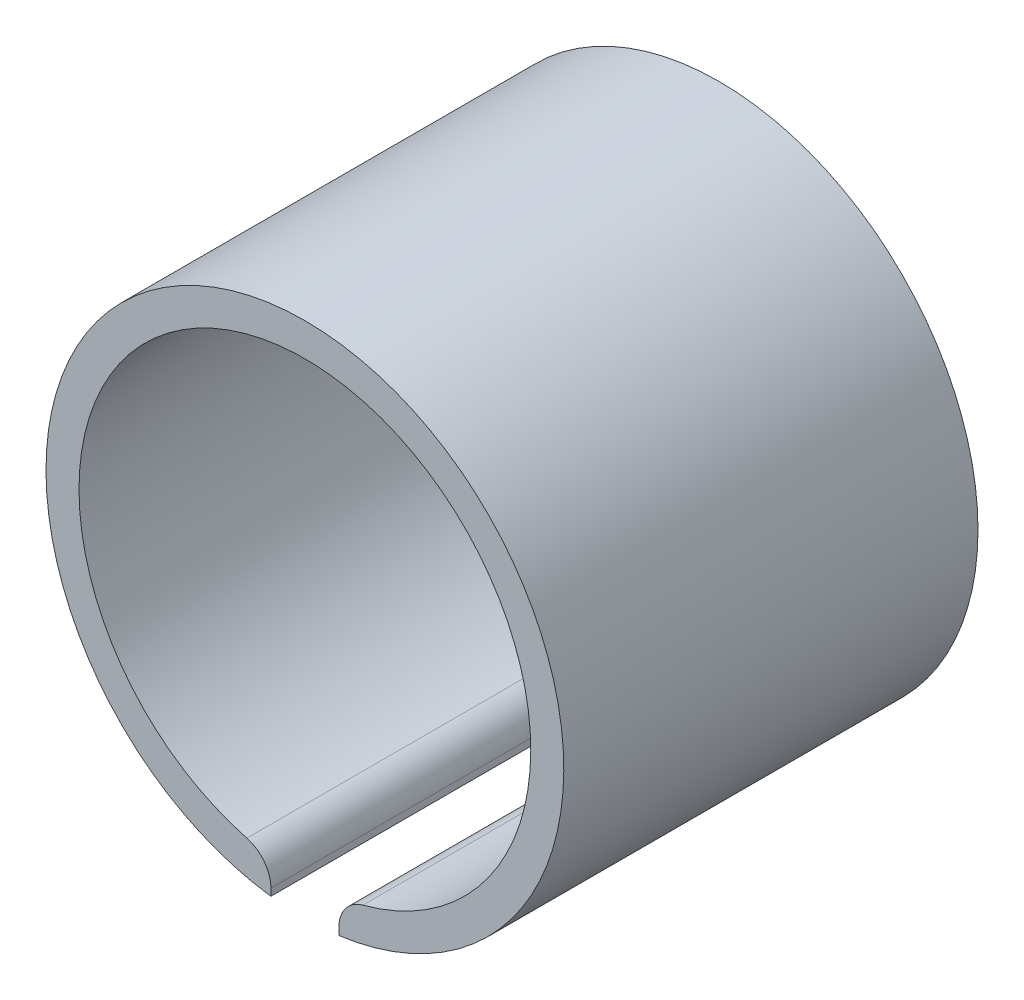
ISO-10303-21;
HEADER;
FILE_DESCRIPTION(('STEP AP214'),'2;1');
FILE_NAME('part.step','',(''),(''),'','','');
FILE_SCHEMA(('AUTOMOTIVE_DESIGN { 1 0 10303 214 1 1 1 1 }'));
ENDSEC;
DATA;
#1=APPLICATION_CONTEXT('core data for automotive mechanical design processes');
#2=APPLICATION_PROTOCOL_DEFINITION('international standard','automotive_design',2000,#1);
#3=PRODUCT_CONTEXT('',#1,'mechanical');
#4=PRODUCT('Part','Part','',(#3));
#5=PRODUCT_RELATED_PRODUCT_CATEGORY('part','',(#4));
#6=PRODUCT_DEFINITION_FORMATION('','',#4);
#7=PRODUCT_DEFINITION_CONTEXT('part definition',#1,'design');
#8=PRODUCT_DEFINITION('design','',#6,#7);
#9=PRODUCT_DEFINITION_SHAPE('','',#8);
#10=(LENGTH_UNIT() NAMED_UNIT(*) SI_UNIT(.MILLI.,.METRE.));
#11=(NAMED_UNIT(*) PLANE_ANGLE_UNIT() SI_UNIT($,.RADIAN.));
#12=(NAMED_UNIT(*) SI_UNIT($,.STERADIAN.) SOLID_ANGLE_UNIT());
#13=UNCERTAINTY_MEASURE_WITH_UNIT(LENGTH_MEASURE(1.E-05),#10,'distance_accuracy_value','');
#14=(GEOMETRIC_REPRESENTATION_CONTEXT(3) GLOBAL_UNCERTAINTY_ASSIGNED_CONTEXT((#13)) GLOBAL_UNIT_ASSIGNED_CONTEXT((#10,
#11,#12)) REPRESENTATION_CONTEXT('',''));
#15=CARTESIAN_POINT('',(0.,0.,0.));
#16=DIRECTION('',(0.,0.,1.));
#17=DIRECTION('',(1.,0.,0.));
#18=AXIS2_PLACEMENT_3D('',#15,#16,#17);
#19=CARTESIAN_POINT('',(0.,0.,2.));
#20=DIRECTION('',(0.,0.,1.));
#21=DIRECTION('',(1.,0.,0.));
#22=AXIS2_PLACEMENT_3D('',#19,#20,#21);
#23=PLANE('',#22);
#24=CARTESIAN_POINT('',(0.,0.,2.));
#25=DIRECTION('',(0.,0.,1.));
#26=DIRECTION('',(1.,0.,0.));
#27=AXIS2_PLACEMENT_3D('',#24,#25,#26);
#28=CIRCLE('',#27,5.);
#29=CARTESIAN_POINT('',(5.,0.,2.));
#30=VERTEX_POINT('',#29);
#31=EDGE_CURVE('E129',#30,#30,#28,.T.);
#32=ORIENTED_EDGE('',*,*,#31,.F.);
#33=EDGE_LOOP('',(#32));
#34=FACE_BOUND('',#33,.T.);
#35=DIRECTION('',(0.,-1.,0.));
#36=VECTOR('',#35,1.);
#37=CARTESIAN_POINT('',(2.625,0.,2.));
#38=LINE('',#37,#36);
#39=CARTESIAN_POINT('',(2.625,-19.2804791174908,2.));
#40=VERTEX_POINT('',#39);
#41=CARTESIAN_POINT('',(2.625,-19.8269860291472,2.));
#42=VERTEX_POINT('',#41);
#43=EDGE_CURVE('E108',#40,#42,#38,.T.);
#44=ORIENTED_EDGE('',*,*,#43,.F.);
#45=CARTESIAN_POINT('',(5.125,-19.2804791174908,2.));
#46=DIRECTION('',(0.,0.,1.));
#47=DIRECTION('',(1.,0.,0.));
#48=AXIS2_PLACEMENT_3D('',#45,#46,#47);
#49=CIRCLE('',#48,2.5);
#50=CARTESIAN_POINT('',(4.4827694235589,-16.8643789774544,2.));
#51=VERTEX_POINT('',#50);
#52=EDGE_CURVE('E47',#40,#51,#49,.F.);
#53=ORIENTED_EDGE('',*,*,#52,.T.);
#54=CARTESIAN_POINT('',(0.,0.,2.));
#55=DIRECTION('',(0.,0.,1.));
#56=DIRECTION('',(1.,0.,0.));
#57=AXIS2_PLACEMENT_3D('',#54,#55,#56);
#58=CIRCLE('',#57,17.45);
#59=CARTESIAN_POINT('',(-4.4827694235589,-16.8643789774544,2.));
#60=VERTEX_POINT('',#59);
#61=EDGE_CURVE('E123',#51,#60,#58,.T.);
#62=ORIENTED_EDGE('',*,*,#61,.T.);
#63=CARTESIAN_POINT('',(-5.125,-19.2804791174908,2.));
#64=DIRECTION('',(0.,0.,1.));
#65=DIRECTION('',(1.,0.,0.));
#66=AXIS2_PLACEMENT_3D('',#63,#64,#65);
#67=CIRCLE('',#66,2.5);
#68=CARTESIAN_POINT('',(-2.625,-19.2804791174908,2.));
#69=VERTEX_POINT('',#68);
#70=EDGE_CURVE('E11',#60,#69,#67,.F.);
#71=ORIENTED_EDGE('',*,*,#70,.T.);
#72=DIRECTION('',(0.,-1.,0.));
#73=VECTOR('',#72,1.);
#74=CARTESIAN_POINT('',(-2.625,0.,2.));
#75=LINE('',#74,#73);
#76=CARTESIAN_POINT('',(-2.625,-19.8269860291472,2.));
#77=VERTEX_POINT('',#76);
#78=EDGE_CURVE('E126',#69,#77,#75,.T.);
#79=ORIENTED_EDGE('',*,*,#78,.T.);
#80=CARTESIAN_POINT('',(0.,0.,2.));
#81=DIRECTION('',(0.,0.,1.));
#82=DIRECTION('',(1.,0.,0.));
#83=AXIS2_PLACEMENT_3D('',#80,#81,#82);
#84=CIRCLE('',#83,20.);
#85=EDGE_CURVE('E135',#77,#42,#84,.T.);
#86=ORIENTED_EDGE('',*,*,#85,.T.);
#87=EDGE_LOOP('',(#44,#53,#62,#71,#79,#86));
#88=FACE_BOUND('',#87,.T.);
#89=ADVANCED_FACE('F39',(#34,#88),#23,.T.);
#90=CARTESIAN_POINT('',(0.,0.,0.));
#91=DIRECTION('',(0.,0.,1.));
#92=DIRECTION('',(1.,0.,0.));
#93=AXIS2_PLACEMENT_3D('',#90,#91,#92);
#94=PLANE('',#93);
#95=CARTESIAN_POINT('',(0.,0.,0.));
#96=DIRECTION('',(0.,0.,1.));
#97=DIRECTION('',(1.,0.,0.));
#98=AXIS2_PLACEMENT_3D('',#95,#96,#97);
#99=CIRCLE('',#98,20.);
#100=CARTESIAN_POINT('',(20.,0.,0.));
#101=VERTEX_POINT('',#100);
#102=EDGE_CURVE('E132',#101,#101,#99,.T.);
#103=ORIENTED_EDGE('',*,*,#102,.F.);
#104=EDGE_LOOP('',(#103));
#105=FACE_BOUND('',#104,.T.);
#106=CARTESIAN_POINT('',(0.,0.,0.));
#107=DIRECTION('',(0.,0.,1.));
#108=DIRECTION('',(1.,0.,0.));
#109=AXIS2_PLACEMENT_3D('',#106,#107,#108);
#110=CIRCLE('',#109,5.);
#111=CARTESIAN_POINT('',(5.,0.,0.));
#112=VERTEX_POINT('',#111);
#113=EDGE_CURVE('E112',#112,#112,#110,.T.);
#114=ORIENTED_EDGE('',*,*,#113,.T.);
#115=EDGE_LOOP('',(#114));
#116=FACE_BOUND('',#115,.T.);
#117=ADVANCED_FACE('F167',(#105,#116),#94,.F.);
#118=CARTESIAN_POINT('',(0.,0.,2.));
#119=DIRECTION('',(0.,0.,-1.));
#120=DIRECTION('',(-1.,0.,0.));
#121=AXIS2_PLACEMENT_3D('',#118,#119,#120);
#122=CYLINDRICAL_SURFACE('',#121,20.);
#123=ORIENTED_EDGE('',*,*,#85,.F.);
#124=DIRECTION('',(0.,0.,-1.));
#125=VECTOR('',#124,1.);
#126=CARTESIAN_POINT('',(-2.625,-19.8269860291472,32.));
#127=LINE('',#126,#125);
#128=CARTESIAN_POINT('',(-2.625,-19.8269860291472,32.));
#129=VERTEX_POINT('',#128);
#130=EDGE_CURVE('E113',#129,#77,#127,.T.);
#131=ORIENTED_EDGE('',*,*,#130,.F.);
#132=CARTESIAN_POINT('',(0.,0.,32.));
#133=DIRECTION('',(0.,0.,1.));
#134=DIRECTION('',(1.,0.,0.));
#135=AXIS2_PLACEMENT_3D('',#132,#133,#134);
#136=CIRCLE('',#135,20.);
#137=CARTESIAN_POINT('',(2.625,-19.8269860291472,32.));
#138=VERTEX_POINT('',#137);
#139=EDGE_CURVE('E95',#138,#129,#136,.T.);
#140=ORIENTED_EDGE('',*,*,#139,.F.);
#141=DIRECTION('',(0.,0.,-1.));
#142=VECTOR('',#141,1.);
#143=CARTESIAN_POINT('',(2.625,-19.8269860291472,32.));
#144=LINE('',#143,#142);
#145=EDGE_CURVE('E105',#138,#42,#144,.T.);
#146=ORIENTED_EDGE('',*,*,#145,.T.);
#147=EDGE_LOOP('',(#123,#131,#140,#146));
#148=FACE_BOUND('',#147,.T.);
#149=ORIENTED_EDGE('',*,*,#102,.T.);
#150=EDGE_LOOP('',(#149));
#151=FACE_BOUND('',#150,.T.);
#152=ADVANCED_FACE('F115',(#148,#151),#122,.T.);
#153=CARTESIAN_POINT('',(0.,0.,2.));
#154=DIRECTION('',(0.,0.,-1.));
#155=DIRECTION('',(-1.,0.,0.));
#156=AXIS2_PLACEMENT_3D('',#153,#154,#155);
#157=CYLINDRICAL_SURFACE('',#156,5.);
#158=ORIENTED_EDGE('',*,*,#31,.T.);
#159=EDGE_LOOP('',(#158));
#160=FACE_BOUND('',#159,.T.);
#161=ORIENTED_EDGE('',*,*,#113,.F.);
#162=EDGE_LOOP('',(#161));
#163=FACE_BOUND('',#162,.T.);
#164=ADVANCED_FACE('F177',(#160,#163),#157,.F.);
#165=CARTESIAN_POINT('',(0.,0.,32.));
#166=DIRECTION('',(0.,0.,-1.));
#167=DIRECTION('',(-1.,0.,0.));
#168=AXIS2_PLACEMENT_3D('',#165,#166,#167);
#169=CYLINDRICAL_SURFACE('',#168,17.45);
#170=ORIENTED_EDGE('',*,*,#61,.F.);
#171=DIRECTION('',(0.,0.,-1.));
#172=VECTOR('',#171,1.);
#173=CARTESIAN_POINT('',(4.4827694235589,-16.8643789774544,32.));
#174=LINE('',#173,#172);
#175=CARTESIAN_POINT('',(4.4827694235589,-16.8643789774544,32.));
#176=VERTEX_POINT('',#175);
#177=EDGE_CURVE('E144',#51,#176,#174,.F.);
#178=ORIENTED_EDGE('',*,*,#177,.T.);
#179=CARTESIAN_POINT('',(0.,0.,32.));
#180=DIRECTION('',(0.,0.,1.));
#181=DIRECTION('',(1.,0.,0.));
#182=AXIS2_PLACEMENT_3D('',#179,#180,#181);
#183=CIRCLE('',#182,17.45);
#184=CARTESIAN_POINT('',(-4.4827694235589,-16.8643789774544,32.));
#185=VERTEX_POINT('',#184);
#186=EDGE_CURVE('E102',#176,#185,#183,.T.);
#187=ORIENTED_EDGE('',*,*,#186,.T.);
#188=DIRECTION('',(0.,0.,-1.));
#189=VECTOR('',#188,1.);
#190=CARTESIAN_POINT('',(-4.4827694235589,-16.8643789774544,32.));
#191=LINE('',#190,#189);
#192=EDGE_CURVE('E141',#185,#60,#191,.T.);
#193=ORIENTED_EDGE('',*,*,#192,.T.);
#194=EDGE_LOOP('',(#170,#178,#187,#193));
#195=FACE_BOUND('',#194,.T.);
#196=ADVANCED_FACE('F153',(#195),#169,.F.);
#197=CARTESIAN_POINT('',(2.625,0.,32.));
#198=DIRECTION('',(1.,0.,0.));
#199=DIRECTION('',(0.,1.,0.));
#200=AXIS2_PLACEMENT_3D('',#197,#198,#199);
#201=PLANE('',#200);
#202=DIRECTION('',(0.,-1.,0.));
#203=VECTOR('',#202,1.);
#204=CARTESIAN_POINT('',(2.625,0.,32.));
#205=LINE('',#204,#203);
#206=CARTESIAN_POINT('',(2.625,-19.2804791174908,32.));
#207=VERTEX_POINT('',#206);
#208=EDGE_CURVE('E90',#207,#138,#205,.T.);
#209=ORIENTED_EDGE('',*,*,#208,.F.);
#210=DIRECTION('',(0.,0.,1.));
#211=VECTOR('',#210,1.);
#212=CARTESIAN_POINT('',(2.625,-19.2804791174908,2.));
#213=LINE('',#212,#211);
#214=EDGE_CURVE('E137',#207,#40,#213,.F.);
#215=ORIENTED_EDGE('',*,*,#214,.T.);
#216=ORIENTED_EDGE('',*,*,#43,.T.);
#217=ORIENTED_EDGE('',*,*,#145,.F.);
#218=EDGE_LOOP('',(#209,#215,#216,#217));
#219=FACE_BOUND('',#218,.T.);
#220=ADVANCED_FACE('F106',(#219),#201,.F.);
#221=CARTESIAN_POINT('',(-2.625,0.,32.));
#222=DIRECTION('',(1.,0.,0.));
#223=DIRECTION('',(0.,1.,0.));
#224=AXIS2_PLACEMENT_3D('',#221,#222,#223);
#225=PLANE('',#224);
#226=ORIENTED_EDGE('',*,*,#78,.F.);
#227=DIRECTION('',(0.,0.,-1.));
#228=VECTOR('',#227,1.);
#229=CARTESIAN_POINT('',(-2.625,-19.2804791174908,32.));
#230=LINE('',#229,#228);
#231=CARTESIAN_POINT('',(-2.625,-19.2804791174908,32.));
#232=VERTEX_POINT('',#231);
#233=EDGE_CURVE('E59',#69,#232,#230,.F.);
#234=ORIENTED_EDGE('',*,*,#233,.T.);
#235=DIRECTION('',(0.,-1.,0.));
#236=VECTOR('',#235,1.);
#237=CARTESIAN_POINT('',(-2.625,0.,32.));
#238=LINE('',#237,#236);
#239=EDGE_CURVE('E118',#232,#129,#238,.T.);
#240=ORIENTED_EDGE('',*,*,#239,.T.);
#241=ORIENTED_EDGE('',*,*,#130,.T.);
#242=EDGE_LOOP('',(#226,#234,#240,#241));
#243=FACE_BOUND('',#242,.T.);
#244=ADVANCED_FACE('F163',(#243),#225,.T.);
#245=CARTESIAN_POINT('',(0.,0.,32.));
#246=DIRECTION('',(0.,0.,1.));
#247=DIRECTION('',(1.,0.,0.));
#248=AXIS2_PLACEMENT_3D('',#245,#246,#247);
#249=PLANE('',#248);
#250=ORIENTED_EDGE('',*,*,#186,.F.);
#251=CARTESIAN_POINT('',(5.125,-19.2804791174908,32.));
#252=DIRECTION('',(0.,0.,1.));
#253=DIRECTION('',(1.,0.,0.));
#254=AXIS2_PLACEMENT_3D('',#251,#252,#253);
#255=CIRCLE('',#254,2.5);
#256=EDGE_CURVE('E98',#176,#207,#255,.T.);
#257=ORIENTED_EDGE('',*,*,#256,.T.);
#258=ORIENTED_EDGE('',*,*,#208,.T.);
#259=ORIENTED_EDGE('',*,*,#139,.T.);
#260=ORIENTED_EDGE('',*,*,#239,.F.);
#261=CARTESIAN_POINT('',(-5.125,-19.2804791174908,32.));
#262=DIRECTION('',(0.,0.,1.));
#263=DIRECTION('',(1.,0.,0.));
#264=AXIS2_PLACEMENT_3D('',#261,#262,#263);
#265=CIRCLE('',#264,2.5);
#266=EDGE_CURVE('E146',#232,#185,#265,.T.);
#267=ORIENTED_EDGE('',*,*,#266,.T.);
#268=EDGE_LOOP('',(#250,#257,#258,#259,#260,#267));
#269=FACE_BOUND('',#268,.T.);
#270=ADVANCED_FACE('F93',(#269),#249,.T.);
#271=CARTESIAN_POINT('',(5.125,-19.2804791174908,32.));
#272=DIRECTION('',(0.,0.,-1.));
#273=DIRECTION('',(-1.,0.,0.));
#274=AXIS2_PLACEMENT_3D('',#271,#272,#273);
#275=CYLINDRICAL_SURFACE('',#274,2.5);
#276=ORIENTED_EDGE('',*,*,#256,.F.);
#277=ORIENTED_EDGE('',*,*,#177,.F.);
#278=ORIENTED_EDGE('',*,*,#52,.F.);
#279=ORIENTED_EDGE('',*,*,#214,.F.);
#280=EDGE_LOOP('',(#276,#277,#278,#279));
#281=FACE_BOUND('',#280,.T.);
#282=ADVANCED_FACE('F156',(#281),#275,.T.);
#283=CARTESIAN_POINT('',(-5.125,-19.2804791174908,32.));
#284=DIRECTION('',(0.,0.,-1.));
#285=DIRECTION('',(-1.,0.,0.));
#286=AXIS2_PLACEMENT_3D('',#283,#284,#285);
#287=CYLINDRICAL_SURFACE('',#286,2.5);
#288=ORIENTED_EDGE('',*,*,#266,.F.);
#289=ORIENTED_EDGE('',*,*,#233,.F.);
#290=ORIENTED_EDGE('',*,*,#70,.F.);
#291=ORIENTED_EDGE('',*,*,#192,.F.);
#292=EDGE_LOOP('',(#288,#289,#290,#291));
#293=FACE_BOUND('',#292,.T.);
#294=ADVANCED_FACE('F41',(#293),#287,.T.);
#295=CLOSED_SHELL('',(#89,#117,#152,#164,#196,#220,#244,#270,#282,#294));
#296=MANIFOLD_SOLID_BREP('B2',#295);
#297=ADVANCED_BREP_SHAPE_REPRESENTATION('',(#18,#296),#14);
#298=SHAPE_DEFINITION_REPRESENTATION(#9,#297);
ENDSEC;
END-ISO-10303-21;
